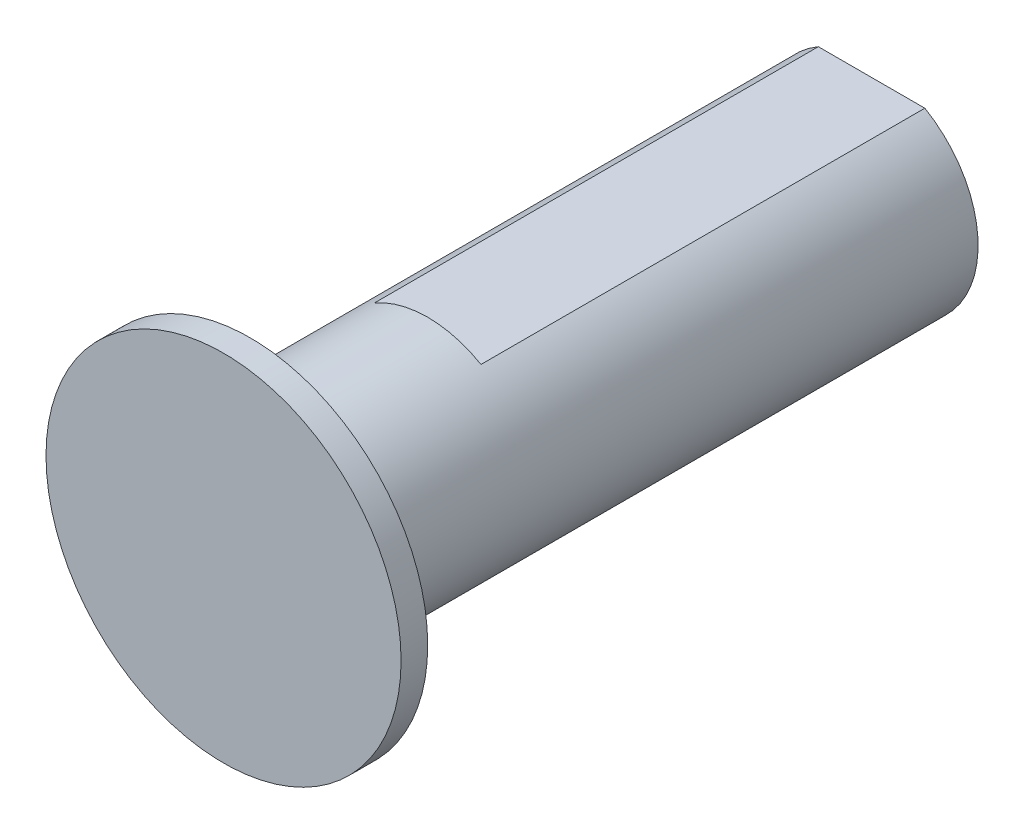
ISO-10303-21;
HEADER;
FILE_DESCRIPTION(('STEP AP214'),'2;1');
FILE_NAME('part.step','',(''),(''),'','','');
FILE_SCHEMA(('AUTOMOTIVE_DESIGN { 1 0 10303 214 1 1 1 1 }'));
ENDSEC;
DATA;
#1=APPLICATION_CONTEXT('core data for automotive mechanical design processes');
#2=APPLICATION_PROTOCOL_DEFINITION('international standard','automotive_design',2000,#1);
#3=PRODUCT_CONTEXT('',#1,'mechanical');
#4=PRODUCT('Part','Part','',(#3));
#5=PRODUCT_RELATED_PRODUCT_CATEGORY('part','',(#4));
#6=PRODUCT_DEFINITION_FORMATION('','',#4);
#7=PRODUCT_DEFINITION_CONTEXT('part definition',#1,'design');
#8=PRODUCT_DEFINITION('design','',#6,#7);
#9=PRODUCT_DEFINITION_SHAPE('','',#8);
#10=(LENGTH_UNIT() NAMED_UNIT(*) SI_UNIT(.MILLI.,.METRE.));
#11=(NAMED_UNIT(*) PLANE_ANGLE_UNIT() SI_UNIT($,.RADIAN.));
#12=(NAMED_UNIT(*) SI_UNIT($,.STERADIAN.) SOLID_ANGLE_UNIT());
#13=UNCERTAINTY_MEASURE_WITH_UNIT(LENGTH_MEASURE(1.E-05),#10,'distance_accuracy_value','');
#14=(GEOMETRIC_REPRESENTATION_CONTEXT(3) GLOBAL_UNCERTAINTY_ASSIGNED_CONTEXT((#13)) GLOBAL_UNIT_ASSIGNED_CONTEXT((#10,
#11,#12)) REPRESENTATION_CONTEXT('',''));
#15=CARTESIAN_POINT('',(0.,0.,0.));
#16=DIRECTION('',(0.,0.,1.));
#17=DIRECTION('',(1.,0.,0.));
#18=AXIS2_PLACEMENT_3D('',#15,#16,#17);
#19=CARTESIAN_POINT('',(0.,0.,35.));
#20=DIRECTION('',(0.,0.,-1.));
#21=DIRECTION('',(-1.,0.,0.));
#22=AXIS2_PLACEMENT_3D('',#19,#20,#21);
#23=CYLINDRICAL_SURFACE('',#22,6.);
#24=CARTESIAN_POINT('',(0.,0.,35.));
#25=DIRECTION('',(0.,0.,1.));
#26=DIRECTION('',(1.,0.,0.));
#27=AXIS2_PLACEMENT_3D('',#24,#25,#26);
#28=CIRCLE('',#27,6.);
#29=CARTESIAN_POINT('',(6.,0.,35.));
#30=VERTEX_POINT('',#29);
#31=EDGE_CURVE('E11',#30,#30,#28,.T.);
#32=ORIENTED_EDGE('',*,*,#31,.F.);
#33=EDGE_LOOP('',(#32));
#34=FACE_BOUND('',#33,.T.);
#35=CARTESIAN_POINT('',(0.,0.,25.));
#36=DIRECTION('',(0.,0.,-1.));
#37=DIRECTION('',(-1.,0.,0.));
#38=AXIS2_PLACEMENT_3D('',#35,#36,#37);
#39=CIRCLE('',#38,6.);
#40=CARTESIAN_POINT('',(-3.,5.19615242270663,25.));
#41=VERTEX_POINT('',#40);
#42=CARTESIAN_POINT('',(3.,5.19615242270663,25.));
#43=VERTEX_POINT('',#42);
#44=EDGE_CURVE('E78',#41,#43,#39,.T.);
#45=ORIENTED_EDGE('',*,*,#44,.F.);
#46=DIRECTION('',(0.,0.,-1.));
#47=VECTOR('',#46,1.);
#48=CARTESIAN_POINT('',(-3.,5.19615242270663,25.));
#49=LINE('',#48,#47);
#50=CARTESIAN_POINT('',(-3.,5.19615242270663,0.));
#51=VERTEX_POINT('',#50);
#52=EDGE_CURVE('E67',#41,#51,#49,.T.);
#53=ORIENTED_EDGE('',*,*,#52,.T.);
#54=CARTESIAN_POINT('',(0.,0.,0.));
#55=DIRECTION('',(0.,0.,1.));
#56=DIRECTION('',(1.,0.,0.));
#57=AXIS2_PLACEMENT_3D('',#54,#55,#56);
#58=CIRCLE('',#57,6.);
#59=CARTESIAN_POINT('',(3.,5.19615242270663,0.));
#60=VERTEX_POINT('',#59);
#61=EDGE_CURVE('E49',#51,#60,#58,.T.);
#62=ORIENTED_EDGE('',*,*,#61,.T.);
#63=DIRECTION('',(0.,0.,-1.));
#64=VECTOR('',#63,1.);
#65=CARTESIAN_POINT('',(3.,5.19615242270663,25.));
#66=LINE('',#65,#64);
#67=EDGE_CURVE('E61',#43,#60,#66,.T.);
#68=ORIENTED_EDGE('',*,*,#67,.F.);
#69=EDGE_LOOP('',(#45,#53,#62,#68));
#70=FACE_BOUND('',#69,.T.);
#71=ADVANCED_FACE('F46',(#34,#70),#23,.T.);
#72=CARTESIAN_POINT('',(0.,0.,0.));
#73=DIRECTION('',(0.,0.,1.));
#74=DIRECTION('',(1.,0.,0.));
#75=AXIS2_PLACEMENT_3D('',#72,#73,#74);
#76=PLANE('',#75);
#77=ORIENTED_EDGE('',*,*,#61,.F.);
#78=DIRECTION('',(-1.,0.,0.));
#79=VECTOR('',#78,1.);
#80=CARTESIAN_POINT('',(0.,5.19615242270663,0.));
#81=LINE('',#80,#79);
#82=EDGE_CURVE('E72',#60,#51,#81,.T.);
#83=ORIENTED_EDGE('',*,*,#82,.F.);
#84=EDGE_LOOP('',(#77,#83));
#85=FACE_BOUND('',#84,.T.);
#86=ADVANCED_FACE('F85',(#85),#76,.F.);
#87=CARTESIAN_POINT('',(0.,5.19615242270663,25.));
#88=DIRECTION('',(0.,-1.,0.));
#89=DIRECTION('',(0.,0.,-1.));
#90=AXIS2_PLACEMENT_3D('',#87,#88,#89);
#91=PLANE('',#90);
#92=ORIENTED_EDGE('',*,*,#82,.T.);
#93=ORIENTED_EDGE('',*,*,#52,.F.);
#94=DIRECTION('',(-1.,0.,0.));
#95=VECTOR('',#94,1.);
#96=CARTESIAN_POINT('',(0.,5.19615242270663,25.));
#97=LINE('',#96,#95);
#98=EDGE_CURVE('E97',#43,#41,#97,.T.);
#99=ORIENTED_EDGE('',*,*,#98,.F.);
#100=ORIENTED_EDGE('',*,*,#67,.T.);
#101=EDGE_LOOP('',(#92,#93,#99,#100));
#102=FACE_BOUND('',#101,.T.);
#103=ADVANCED_FACE('F73',(#102),#91,.F.);
#104=CARTESIAN_POINT('',(0.,0.,25.));
#105=DIRECTION('',(0.,0.,-1.));
#106=DIRECTION('',(-1.,0.,0.));
#107=AXIS2_PLACEMENT_3D('',#104,#105,#106);
#108=PLANE('',#107);
#109=ORIENTED_EDGE('',*,*,#44,.T.);
#110=ORIENTED_EDGE('',*,*,#98,.T.);
#111=EDGE_LOOP('',(#109,#110));
#112=FACE_BOUND('',#111,.T.);
#113=ADVANCED_FACE('F143',(#112),#108,.T.);
#114=CARTESIAN_POINT('',(0.,0.,36.5));
#115=DIRECTION('',(0.,0.,-1.));
#116=DIRECTION('',(-1.,0.,0.));
#117=AXIS2_PLACEMENT_3D('',#114,#115,#116);
#118=CYLINDRICAL_SURFACE('',#117,10.);
#119=CARTESIAN_POINT('',(0.,0.,36.5));
#120=DIRECTION('',(0.,0.,1.));
#121=DIRECTION('',(1.,0.,0.));
#122=AXIS2_PLACEMENT_3D('',#119,#120,#121);
#123=CIRCLE('',#122,10.);
#124=CARTESIAN_POINT('',(10.,0.,36.5));
#125=VERTEX_POINT('',#124);
#126=EDGE_CURVE('E79',#125,#125,#123,.T.);
#127=ORIENTED_EDGE('',*,*,#126,.F.);
#128=EDGE_LOOP('',(#127));
#129=FACE_BOUND('',#128,.T.);
#130=CARTESIAN_POINT('',(0.,0.,35.));
#131=DIRECTION('',(0.,0.,1.));
#132=DIRECTION('',(1.,0.,0.));
#133=AXIS2_PLACEMENT_3D('',#130,#131,#132);
#134=CIRCLE('',#133,10.);
#135=CARTESIAN_POINT('',(10.,0.,35.));
#136=VERTEX_POINT('',#135);
#137=EDGE_CURVE('E113',#136,#136,#134,.T.);
#138=ORIENTED_EDGE('',*,*,#137,.T.);
#139=EDGE_LOOP('',(#138));
#140=FACE_BOUND('',#139,.T.);
#141=ADVANCED_FACE('F121',(#129,#140),#118,.T.);
#142=CARTESIAN_POINT('',(0.,0.,36.5));
#143=DIRECTION('',(0.,0.,1.));
#144=DIRECTION('',(1.,0.,0.));
#145=AXIS2_PLACEMENT_3D('',#142,#143,#144);
#146=PLANE('',#145);
#147=ORIENTED_EDGE('',*,*,#126,.T.);
#148=EDGE_LOOP('',(#147));
#149=FACE_BOUND('',#148,.T.);
#150=ADVANCED_FACE('F125',(#149),#146,.T.);
#151=CARTESIAN_POINT('',(0.,0.,35.));
#152=DIRECTION('',(0.,0.,1.));
#153=DIRECTION('',(1.,0.,0.));
#154=AXIS2_PLACEMENT_3D('',#151,#152,#153);
#155=PLANE('',#154);
#156=ORIENTED_EDGE('',*,*,#31,.T.);
#157=EDGE_LOOP('',(#156));
#158=FACE_BOUND('',#157,.T.);
#159=ORIENTED_EDGE('',*,*,#137,.F.);
#160=EDGE_LOOP('',(#159));
#161=FACE_BOUND('',#160,.T.);
#162=ADVANCED_FACE('F123',(#158,#161),#155,.F.);
#163=CLOSED_SHELL('',(#71,#86,#103,#113,#141,#150,#162));
#164=MANIFOLD_SOLID_BREP('B2',#163);
#165=ADVANCED_BREP_SHAPE_REPRESENTATION('',(#18,#164),#14);
#166=SHAPE_DEFINITION_REPRESENTATION(#9,#165);
ENDSEC;
END-ISO-10303-21;
